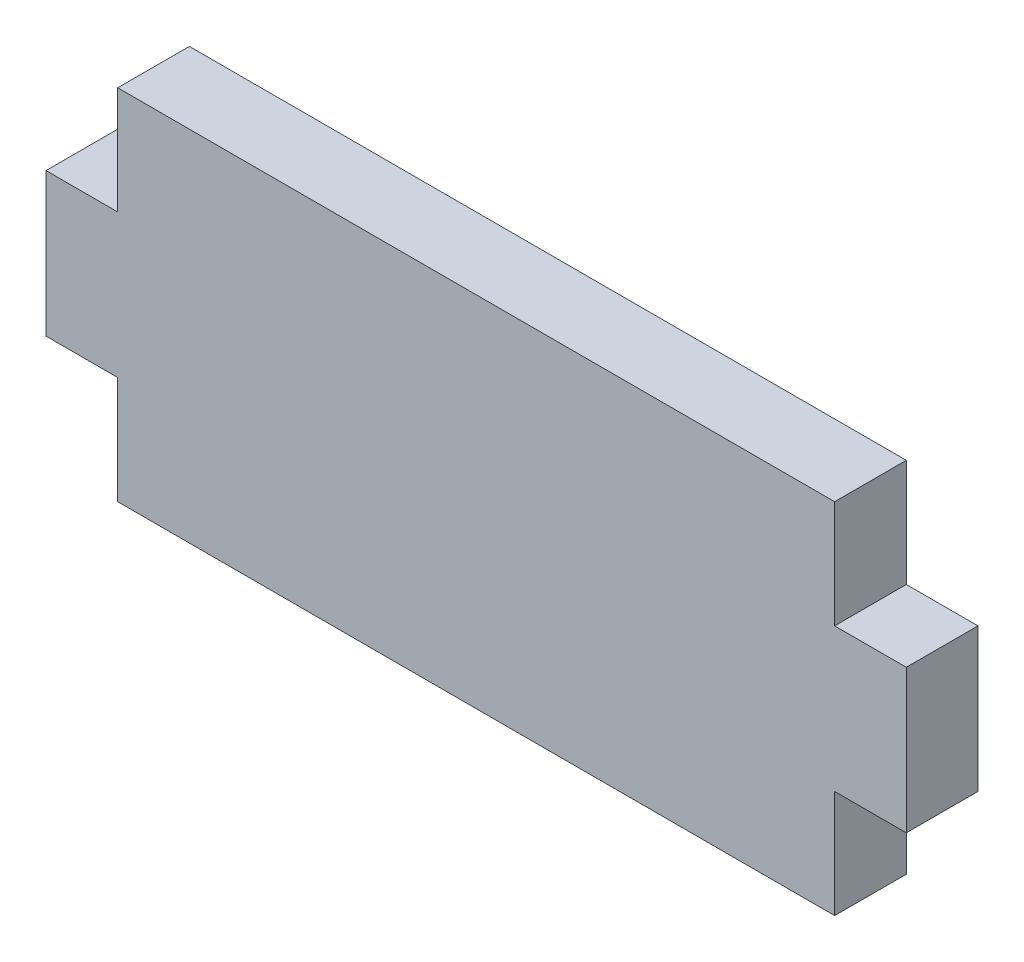
ISO-10303-21;
HEADER;
FILE_DESCRIPTION(('STEP AP214'),'2;1');
FILE_NAME('part.step','',(''),(''),'','','');
FILE_SCHEMA(('AUTOMOTIVE_DESIGN { 1 0 10303 214 1 1 1 1 }'));
ENDSEC;
DATA;
#1=APPLICATION_CONTEXT('core data for automotive mechanical design processes');
#2=APPLICATION_PROTOCOL_DEFINITION('international standard','automotive_design',2000,#1);
#3=PRODUCT_CONTEXT('',#1,'mechanical');
#4=PRODUCT('Part','Part','',(#3));
#5=PRODUCT_RELATED_PRODUCT_CATEGORY('part','',(#4));
#6=PRODUCT_DEFINITION_FORMATION('','',#4);
#7=PRODUCT_DEFINITION_CONTEXT('part definition',#1,'design');
#8=PRODUCT_DEFINITION('design','',#6,#7);
#9=PRODUCT_DEFINITION_SHAPE('','',#8);
#10=(LENGTH_UNIT() NAMED_UNIT(*) SI_UNIT(.MILLI.,.METRE.));
#11=(NAMED_UNIT(*) PLANE_ANGLE_UNIT() SI_UNIT($,.RADIAN.));
#12=(NAMED_UNIT(*) SI_UNIT($,.STERADIAN.) SOLID_ANGLE_UNIT());
#13=UNCERTAINTY_MEASURE_WITH_UNIT(LENGTH_MEASURE(1.E-05),#10,'distance_accuracy_value','');
#14=(GEOMETRIC_REPRESENTATION_CONTEXT(3) GLOBAL_UNCERTAINTY_ASSIGNED_CONTEXT((#13)) GLOBAL_UNIT_ASSIGNED_CONTEXT((#10,
#11,#12)) REPRESENTATION_CONTEXT('',''));
#15=CARTESIAN_POINT('',(0.,0.,0.));
#16=DIRECTION('',(0.,0.,1.));
#17=DIRECTION('',(1.,0.,0.));
#18=AXIS2_PLACEMENT_3D('',#15,#16,#17);
#19=CARTESIAN_POINT('',(0.,35.,10.));
#20=DIRECTION('',(0.,-1.,0.));
#21=DIRECTION('',(0.,0.,-1.));
#22=AXIS2_PLACEMENT_3D('',#19,#20,#21);
#23=PLANE('',#22);
#24=DIRECTION('',(-1.,0.,0.));
#25=VECTOR('',#24,1.);
#26=CARTESIAN_POINT('',(0.,35.,0.));
#27=LINE('',#26,#25);
#28=CARTESIAN_POINT('',(0.,35.,0.));
#29=VERTEX_POINT('',#28);
#30=CARTESIAN_POINT('',(-10.,35.,0.));
#31=VERTEX_POINT('',#30);
#32=EDGE_CURVE('E160',#29,#31,#27,.T.);
#33=ORIENTED_EDGE('',*,*,#32,.T.);
#34=DIRECTION('',(0.,0.,-1.));
#35=VECTOR('',#34,1.);
#36=CARTESIAN_POINT('',(-10.,35.,10.));
#37=LINE('',#36,#35);
#38=CARTESIAN_POINT('',(-10.,35.,10.));
#39=VERTEX_POINT('',#38);
#40=EDGE_CURVE('E11',#39,#31,#37,.T.);
#41=ORIENTED_EDGE('',*,*,#40,.F.);
#42=DIRECTION('',(-1.,0.,0.));
#43=VECTOR('',#42,1.);
#44=CARTESIAN_POINT('',(0.,35.,10.));
#45=LINE('',#44,#43);
#46=CARTESIAN_POINT('',(0.,35.,10.));
#47=VERTEX_POINT('',#46);
#48=EDGE_CURVE('E223',#47,#39,#45,.T.);
#49=ORIENTED_EDGE('',*,*,#48,.F.);
#50=DIRECTION('',(0.,0.,-1.));
#51=VECTOR('',#50,1.);
#52=CARTESIAN_POINT('',(0.,35.,10.));
#53=LINE('',#52,#51);
#54=EDGE_CURVE('E52',#47,#29,#53,.T.);
#55=ORIENTED_EDGE('',*,*,#54,.T.);
#56=EDGE_LOOP('',(#33,#41,#49,#55));
#57=FACE_BOUND('',#56,.T.);
#58=ADVANCED_FACE('F36',(#57),#23,.F.);
#59=CARTESIAN_POINT('',(-10.,0.,10.));
#60=DIRECTION('',(1.,0.,0.));
#61=DIRECTION('',(0.,1.,0.));
#62=AXIS2_PLACEMENT_3D('',#59,#60,#61);
#63=PLANE('',#62);
#64=DIRECTION('',(0.,-1.,0.));
#65=VECTOR('',#64,1.);
#66=CARTESIAN_POINT('',(-10.,0.,0.));
#67=LINE('',#66,#65);
#68=CARTESIAN_POINT('',(-10.,15.,0.));
#69=VERTEX_POINT('',#68);
#70=EDGE_CURVE('E162',#31,#69,#67,.T.);
#71=ORIENTED_EDGE('',*,*,#70,.T.);
#72=DIRECTION('',(0.,0.,-1.));
#73=VECTOR('',#72,1.);
#74=CARTESIAN_POINT('',(-10.,15.,10.));
#75=LINE('',#74,#73);
#76=CARTESIAN_POINT('',(-10.,15.,10.));
#77=VERTEX_POINT('',#76);
#78=EDGE_CURVE('E44',#77,#69,#75,.T.);
#79=ORIENTED_EDGE('',*,*,#78,.F.);
#80=DIRECTION('',(0.,-1.,0.));
#81=VECTOR('',#80,1.);
#82=CARTESIAN_POINT('',(-10.,0.,10.));
#83=LINE('',#82,#81);
#84=EDGE_CURVE('E102',#39,#77,#83,.T.);
#85=ORIENTED_EDGE('',*,*,#84,.F.);
#86=ORIENTED_EDGE('',*,*,#40,.T.);
#87=EDGE_LOOP('',(#71,#79,#85,#86));
#88=FACE_BOUND('',#87,.T.);
#89=ADVANCED_FACE('F209',(#88),#63,.F.);
#90=CARTESIAN_POINT('',(0.,15.,10.));
#91=DIRECTION('',(0.,-1.,0.));
#92=DIRECTION('',(0.,0.,-1.));
#93=AXIS2_PLACEMENT_3D('',#90,#91,#92);
#94=PLANE('',#93);
#95=DIRECTION('',(-1.,0.,0.));
#96=VECTOR('',#95,1.);
#97=CARTESIAN_POINT('',(0.,15.,0.));
#98=LINE('',#97,#96);
#99=CARTESIAN_POINT('',(0.,15.,0.));
#100=VERTEX_POINT('',#99);
#101=EDGE_CURVE('E165',#100,#69,#98,.T.);
#102=ORIENTED_EDGE('',*,*,#101,.F.);
#103=DIRECTION('',(0.,0.,-1.));
#104=VECTOR('',#103,1.);
#105=CARTESIAN_POINT('',(0.,15.,10.));
#106=LINE('',#105,#104);
#107=CARTESIAN_POINT('',(0.,15.,10.));
#108=VERTEX_POINT('',#107);
#109=EDGE_CURVE('E202',#108,#100,#106,.T.);
#110=ORIENTED_EDGE('',*,*,#109,.F.);
#111=DIRECTION('',(-1.,0.,0.));
#112=VECTOR('',#111,1.);
#113=CARTESIAN_POINT('',(0.,15.,10.));
#114=LINE('',#113,#112);
#115=EDGE_CURVE('E208',#108,#77,#114,.T.);
#116=ORIENTED_EDGE('',*,*,#115,.T.);
#117=ORIENTED_EDGE('',*,*,#78,.T.);
#118=EDGE_LOOP('',(#102,#110,#116,#117));
#119=FACE_BOUND('',#118,.T.);
#120=ADVANCED_FACE('F206',(#119),#94,.T.);
#121=CARTESIAN_POINT('',(0.,0.,10.));
#122=DIRECTION('',(-1.,0.,0.));
#123=DIRECTION('',(0.,0.,1.));
#124=AXIS2_PLACEMENT_3D('',#121,#122,#123);
#125=PLANE('',#124);
#126=DIRECTION('',(0.,1.,0.));
#127=VECTOR('',#126,1.);
#128=CARTESIAN_POINT('',(0.,0.,0.));
#129=LINE('',#128,#127);
#130=CARTESIAN_POINT('',(0.,0.,0.));
#131=VERTEX_POINT('',#130);
#132=EDGE_CURVE('E168',#131,#100,#129,.T.);
#133=ORIENTED_EDGE('',*,*,#132,.F.);
#134=DIRECTION('',(0.,0.,-1.));
#135=VECTOR('',#134,1.);
#136=CARTESIAN_POINT('',(0.,0.,10.));
#137=LINE('',#136,#135);
#138=CARTESIAN_POINT('',(0.,0.,10.));
#139=VERTEX_POINT('',#138);
#140=EDGE_CURVE('E200',#139,#131,#137,.T.);
#141=ORIENTED_EDGE('',*,*,#140,.F.);
#142=DIRECTION('',(0.,1.,0.));
#143=VECTOR('',#142,1.);
#144=CARTESIAN_POINT('',(0.,0.,10.));
#145=LINE('',#144,#143);
#146=EDGE_CURVE('E156',#139,#108,#145,.T.);
#147=ORIENTED_EDGE('',*,*,#146,.T.);
#148=ORIENTED_EDGE('',*,*,#109,.T.);
#149=EDGE_LOOP('',(#133,#141,#147,#148));
#150=FACE_BOUND('',#149,.T.);
#151=ADVANCED_FACE('F217',(#150),#125,.T.);
#152=CARTESIAN_POINT('',(0.,0.,10.));
#153=DIRECTION('',(0.,1.,0.));
#154=DIRECTION('',(0.,0.,1.));
#155=AXIS2_PLACEMENT_3D('',#152,#153,#154);
#156=PLANE('',#155);
#157=DIRECTION('',(1.,0.,0.));
#158=VECTOR('',#157,1.);
#159=CARTESIAN_POINT('',(0.,0.,0.));
#160=LINE('',#159,#158);
#161=CARTESIAN_POINT('',(100.,0.,0.));
#162=VERTEX_POINT('',#161);
#163=EDGE_CURVE('E171',#131,#162,#160,.T.);
#164=ORIENTED_EDGE('',*,*,#163,.T.);
#165=DIRECTION('',(0.,0.,-1.));
#166=VECTOR('',#165,1.);
#167=CARTESIAN_POINT('',(100.,0.,10.));
#168=LINE('',#167,#166);
#169=CARTESIAN_POINT('',(100.,0.,10.));
#170=VERTEX_POINT('',#169);
#171=EDGE_CURVE('E197',#170,#162,#168,.T.);
#172=ORIENTED_EDGE('',*,*,#171,.F.);
#173=DIRECTION('',(1.,0.,0.));
#174=VECTOR('',#173,1.);
#175=CARTESIAN_POINT('',(0.,0.,10.));
#176=LINE('',#175,#174);
#177=EDGE_CURVE('E222',#139,#170,#176,.T.);
#178=ORIENTED_EDGE('',*,*,#177,.F.);
#179=ORIENTED_EDGE('',*,*,#140,.T.);
#180=EDGE_LOOP('',(#164,#172,#178,#179));
#181=FACE_BOUND('',#180,.T.);
#182=ADVANCED_FACE('F246',(#181),#156,.F.);
#183=CARTESIAN_POINT('',(100.,0.,10.));
#184=DIRECTION('',(-1.,0.,0.));
#185=DIRECTION('',(0.,0.,1.));
#186=AXIS2_PLACEMENT_3D('',#183,#184,#185);
#187=PLANE('',#186);
#188=DIRECTION('',(0.,1.,0.));
#189=VECTOR('',#188,1.);
#190=CARTESIAN_POINT('',(100.,0.,0.));
#191=LINE('',#190,#189);
#192=CARTESIAN_POINT('',(100.,15.,0.));
#193=VERTEX_POINT('',#192);
#194=EDGE_CURVE('E174',#162,#193,#191,.T.);
#195=ORIENTED_EDGE('',*,*,#194,.T.);
#196=DIRECTION('',(0.,0.,-1.));
#197=VECTOR('',#196,1.);
#198=CARTESIAN_POINT('',(100.,15.,10.));
#199=LINE('',#198,#197);
#200=CARTESIAN_POINT('',(100.,15.,10.));
#201=VERTEX_POINT('',#200);
#202=EDGE_CURVE('E194',#201,#193,#199,.T.);
#203=ORIENTED_EDGE('',*,*,#202,.F.);
#204=DIRECTION('',(0.,1.,0.));
#205=VECTOR('',#204,1.);
#206=CARTESIAN_POINT('',(100.,0.,10.));
#207=LINE('',#206,#205);
#208=EDGE_CURVE('E142',#170,#201,#207,.T.);
#209=ORIENTED_EDGE('',*,*,#208,.F.);
#210=ORIENTED_EDGE('',*,*,#171,.T.);
#211=EDGE_LOOP('',(#195,#203,#209,#210));
#212=FACE_BOUND('',#211,.T.);
#213=ADVANCED_FACE('F249',(#212),#187,.F.);
#214=CARTESIAN_POINT('',(0.,15.,10.));
#215=DIRECTION('',(0.,1.,0.));
#216=DIRECTION('',(0.,0.,1.));
#217=AXIS2_PLACEMENT_3D('',#214,#215,#216);
#218=PLANE('',#217);
#219=DIRECTION('',(1.,0.,0.));
#220=VECTOR('',#219,1.);
#221=CARTESIAN_POINT('',(0.,15.,0.));
#222=LINE('',#221,#220);
#223=CARTESIAN_POINT('',(110.,15.,0.));
#224=VERTEX_POINT('',#223);
#225=EDGE_CURVE('E176',#193,#224,#222,.T.);
#226=ORIENTED_EDGE('',*,*,#225,.T.);
#227=DIRECTION('',(0.,0.,-1.));
#228=VECTOR('',#227,1.);
#229=CARTESIAN_POINT('',(110.,15.,10.));
#230=LINE('',#229,#228);
#231=CARTESIAN_POINT('',(110.,15.,10.));
#232=VERTEX_POINT('',#231);
#233=EDGE_CURVE('E192',#232,#224,#230,.T.);
#234=ORIENTED_EDGE('',*,*,#233,.F.);
#235=DIRECTION('',(1.,0.,0.));
#236=VECTOR('',#235,1.);
#237=CARTESIAN_POINT('',(0.,15.,10.));
#238=LINE('',#237,#236);
#239=EDGE_CURVE('E228',#201,#232,#238,.T.);
#240=ORIENTED_EDGE('',*,*,#239,.F.);
#241=ORIENTED_EDGE('',*,*,#202,.T.);
#242=EDGE_LOOP('',(#226,#234,#240,#241));
#243=FACE_BOUND('',#242,.T.);
#244=ADVANCED_FACE('F251',(#243),#218,.F.);
#245=CARTESIAN_POINT('',(110.,0.,10.));
#246=DIRECTION('',(1.,0.,0.));
#247=DIRECTION('',(0.,0.,-1.));
#248=AXIS2_PLACEMENT_3D('',#245,#246,#247);
#249=PLANE('',#248);
#250=DIRECTION('',(0.,-1.,0.));
#251=VECTOR('',#250,1.);
#252=CARTESIAN_POINT('',(110.,0.,0.));
#253=LINE('',#252,#251);
#254=CARTESIAN_POINT('',(110.,35.,0.));
#255=VERTEX_POINT('',#254);
#256=EDGE_CURVE('E179',#255,#224,#253,.T.);
#257=ORIENTED_EDGE('',*,*,#256,.F.);
#258=DIRECTION('',(0.,0.,-1.));
#259=VECTOR('',#258,1.);
#260=CARTESIAN_POINT('',(110.,35.,10.));
#261=LINE('',#260,#259);
#262=CARTESIAN_POINT('',(110.,35.,10.));
#263=VERTEX_POINT('',#262);
#264=EDGE_CURVE('E190',#263,#255,#261,.T.);
#265=ORIENTED_EDGE('',*,*,#264,.F.);
#266=DIRECTION('',(0.,-1.,0.));
#267=VECTOR('',#266,1.);
#268=CARTESIAN_POINT('',(110.,0.,10.));
#269=LINE('',#268,#267);
#270=EDGE_CURVE('E229',#263,#232,#269,.T.);
#271=ORIENTED_EDGE('',*,*,#270,.T.);
#272=ORIENTED_EDGE('',*,*,#233,.T.);
#273=EDGE_LOOP('',(#257,#265,#271,#272));
#274=FACE_BOUND('',#273,.T.);
#275=ADVANCED_FACE('F254',(#274),#249,.T.);
#276=CARTESIAN_POINT('',(0.,35.,10.));
#277=DIRECTION('',(0.,1.,0.));
#278=DIRECTION('',(0.,0.,1.));
#279=AXIS2_PLACEMENT_3D('',#276,#277,#278);
#280=PLANE('',#279);
#281=DIRECTION('',(1.,0.,0.));
#282=VECTOR('',#281,1.);
#283=CARTESIAN_POINT('',(0.,35.,0.));
#284=LINE('',#283,#282);
#285=CARTESIAN_POINT('',(100.,35.,0.));
#286=VERTEX_POINT('',#285);
#287=EDGE_CURVE('E182',#286,#255,#284,.T.);
#288=ORIENTED_EDGE('',*,*,#287,.F.);
#289=DIRECTION('',(0.,0.,-1.));
#290=VECTOR('',#289,1.);
#291=CARTESIAN_POINT('',(100.,35.,10.));
#292=LINE('',#291,#290);
#293=CARTESIAN_POINT('',(100.,35.,10.));
#294=VERTEX_POINT('',#293);
#295=EDGE_CURVE('E150',#294,#286,#292,.T.);
#296=ORIENTED_EDGE('',*,*,#295,.F.);
#297=DIRECTION('',(1.,0.,0.));
#298=VECTOR('',#297,1.);
#299=CARTESIAN_POINT('',(0.,35.,10.));
#300=LINE('',#299,#298);
#301=EDGE_CURVE('E139',#294,#263,#300,.T.);
#302=ORIENTED_EDGE('',*,*,#301,.T.);
#303=ORIENTED_EDGE('',*,*,#264,.T.);
#304=EDGE_LOOP('',(#288,#296,#302,#303));
#305=FACE_BOUND('',#304,.T.);
#306=ADVANCED_FACE('F234',(#305),#280,.T.);
#307=CARTESIAN_POINT('',(100.,50.,0.));
#308=VERTEX_POINT('',#307);
#309=EDGE_CURVE('E147',#286,#308,#191,.T.);
#310=ORIENTED_EDGE('',*,*,#309,.T.);
#311=DIRECTION('',(0.,0.,-1.));
#312=VECTOR('',#311,1.);
#313=CARTESIAN_POINT('',(100.,50.,10.));
#314=LINE('',#313,#312);
#315=CARTESIAN_POINT('',(100.,50.,10.));
#316=VERTEX_POINT('',#315);
#317=EDGE_CURVE('E144',#316,#308,#314,.T.);
#318=ORIENTED_EDGE('',*,*,#317,.F.);
#319=EDGE_CURVE('E131',#294,#316,#207,.T.);
#320=ORIENTED_EDGE('',*,*,#319,.F.);
#321=ORIENTED_EDGE('',*,*,#295,.T.);
#322=EDGE_LOOP('',(#310,#318,#320,#321));
#323=FACE_BOUND('',#322,.T.);
#324=ADVANCED_FACE('F145',(#323),#187,.F.);
#325=CARTESIAN_POINT('',(0.,50.,10.));
#326=DIRECTION('',(0.,1.,0.));
#327=DIRECTION('',(0.,0.,1.));
#328=AXIS2_PLACEMENT_3D('',#325,#326,#327);
#329=PLANE('',#328);
#330=DIRECTION('',(1.,0.,0.));
#331=VECTOR('',#330,1.);
#332=CARTESIAN_POINT('',(0.,50.,0.));
#333=LINE('',#332,#331);
#334=CARTESIAN_POINT('',(0.,50.,0.));
#335=VERTEX_POINT('',#334);
#336=EDGE_CURVE('E185',#335,#308,#333,.T.);
#337=ORIENTED_EDGE('',*,*,#336,.F.);
#338=DIRECTION('',(0.,0.,-1.));
#339=VECTOR('',#338,1.);
#340=CARTESIAN_POINT('',(0.,50.,10.));
#341=LINE('',#340,#339);
#342=CARTESIAN_POINT('',(0.,50.,10.));
#343=VERTEX_POINT('',#342);
#344=EDGE_CURVE('E90',#343,#335,#341,.T.);
#345=ORIENTED_EDGE('',*,*,#344,.F.);
#346=DIRECTION('',(1.,0.,0.));
#347=VECTOR('',#346,1.);
#348=CARTESIAN_POINT('',(0.,50.,10.));
#349=LINE('',#348,#347);
#350=EDGE_CURVE('E136',#343,#316,#349,.T.);
#351=ORIENTED_EDGE('',*,*,#350,.T.);
#352=ORIENTED_EDGE('',*,*,#317,.T.);
#353=EDGE_LOOP('',(#337,#345,#351,#352));
#354=FACE_BOUND('',#353,.T.);
#355=ADVANCED_FACE('F152',(#354),#329,.T.);
#356=EDGE_CURVE('E172',#29,#335,#129,.T.);
#357=ORIENTED_EDGE('',*,*,#356,.F.);
#358=ORIENTED_EDGE('',*,*,#54,.F.);
#359=EDGE_CURVE('E153',#47,#343,#145,.T.);
#360=ORIENTED_EDGE('',*,*,#359,.T.);
#361=ORIENTED_EDGE('',*,*,#344,.T.);
#362=EDGE_LOOP('',(#357,#358,#360,#361));
#363=FACE_BOUND('',#362,.T.);
#364=ADVANCED_FACE('F264',(#363),#125,.T.);
#365=CARTESIAN_POINT('',(0.,0.,10.));
#366=DIRECTION('',(0.,0.,1.));
#367=DIRECTION('',(1.,0.,0.));
#368=AXIS2_PLACEMENT_3D('',#365,#366,#367);
#369=PLANE('',#368);
#370=ORIENTED_EDGE('',*,*,#48,.T.);
#371=ORIENTED_EDGE('',*,*,#84,.T.);
#372=ORIENTED_EDGE('',*,*,#115,.F.);
#373=ORIENTED_EDGE('',*,*,#146,.F.);
#374=ORIENTED_EDGE('',*,*,#177,.T.);
#375=ORIENTED_EDGE('',*,*,#208,.T.);
#376=ORIENTED_EDGE('',*,*,#239,.T.);
#377=ORIENTED_EDGE('',*,*,#270,.F.);
#378=ORIENTED_EDGE('',*,*,#301,.F.);
#379=ORIENTED_EDGE('',*,*,#319,.T.);
#380=ORIENTED_EDGE('',*,*,#350,.F.);
#381=ORIENTED_EDGE('',*,*,#359,.F.);
#382=EDGE_LOOP('',(#370,#371,#372,#373,#374,#375,#376,#377,#378,#379,#380,#381));
#383=FACE_BOUND('',#382,.T.);
#384=ADVANCED_FACE('F133',(#383),#369,.T.);
#385=CARTESIAN_POINT('',(0.,0.,0.));
#386=DIRECTION('',(0.,0.,1.));
#387=DIRECTION('',(1.,0.,0.));
#388=AXIS2_PLACEMENT_3D('',#385,#386,#387);
#389=PLANE('',#388);
#390=ORIENTED_EDGE('',*,*,#32,.F.);
#391=ORIENTED_EDGE('',*,*,#356,.T.);
#392=ORIENTED_EDGE('',*,*,#336,.T.);
#393=ORIENTED_EDGE('',*,*,#309,.F.);
#394=ORIENTED_EDGE('',*,*,#287,.T.);
#395=ORIENTED_EDGE('',*,*,#256,.T.);
#396=ORIENTED_EDGE('',*,*,#225,.F.);
#397=ORIENTED_EDGE('',*,*,#194,.F.);
#398=ORIENTED_EDGE('',*,*,#163,.F.);
#399=ORIENTED_EDGE('',*,*,#132,.T.);
#400=ORIENTED_EDGE('',*,*,#101,.T.);
#401=ORIENTED_EDGE('',*,*,#70,.F.);
#402=EDGE_LOOP('',(#390,#391,#392,#393,#394,#395,#396,#397,#398,#399,#400,#401));
#403=FACE_BOUND('',#402,.T.);
#404=ADVANCED_FACE('F212',(#403),#389,.F.);
#405=CLOSED_SHELL('',(#58,#89,#120,#151,#182,#213,#244,#275,#306,#324,#355,#364,#384,#404));
#406=MANIFOLD_SOLID_BREP('B2',#405);
#407=ADVANCED_BREP_SHAPE_REPRESENTATION('',(#18,#406),#14);
#408=SHAPE_DEFINITION_REPRESENTATION(#9,#407);
ENDSEC;
END-ISO-10303-21;
